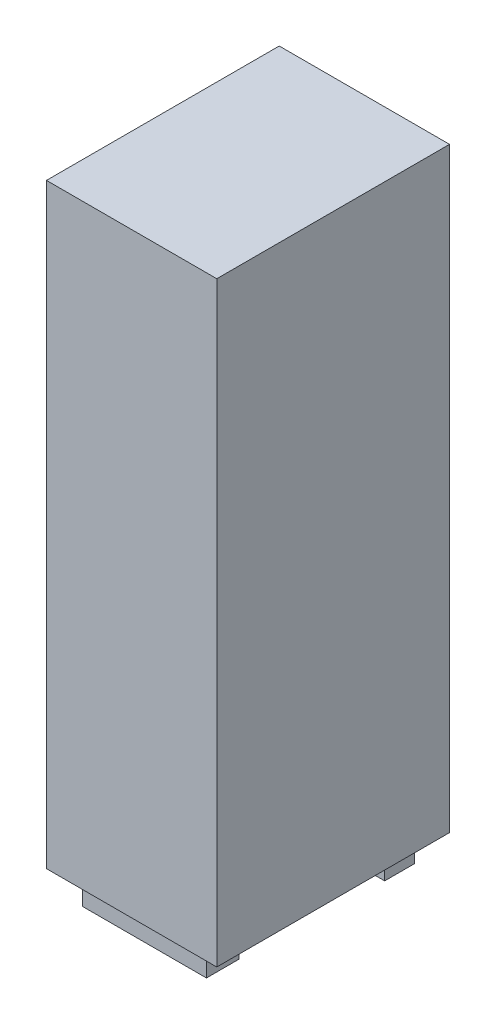
ISO-10303-21;
HEADER;
FILE_DESCRIPTION(('STEP AP214'),'2;1');
FILE_NAME('part.step','',(''),(''),'','','');
FILE_SCHEMA(('AUTOMOTIVE_DESIGN { 1 0 10303 214 1 1 1 1 }'));
ENDSEC;
DATA;
#1=APPLICATION_CONTEXT('core data for automotive mechanical design processes');
#2=APPLICATION_PROTOCOL_DEFINITION('international standard','automotive_design',2000,#1);
#3=PRODUCT_CONTEXT('',#1,'mechanical');
#4=PRODUCT('Part','Part','',(#3));
#5=PRODUCT_RELATED_PRODUCT_CATEGORY('part','',(#4));
#6=PRODUCT_DEFINITION_FORMATION('','',#4);
#7=PRODUCT_DEFINITION_CONTEXT('part definition',#1,'design');
#8=PRODUCT_DEFINITION('design','',#6,#7);
#9=PRODUCT_DEFINITION_SHAPE('','',#8);
#10=(LENGTH_UNIT() NAMED_UNIT(*) SI_UNIT(.MILLI.,.METRE.));
#11=(NAMED_UNIT(*) PLANE_ANGLE_UNIT() SI_UNIT($,.RADIAN.));
#12=(NAMED_UNIT(*) SI_UNIT($,.STERADIAN.) SOLID_ANGLE_UNIT());
#13=UNCERTAINTY_MEASURE_WITH_UNIT(LENGTH_MEASURE(1.E-05),#10,'distance_accuracy_value','');
#14=(GEOMETRIC_REPRESENTATION_CONTEXT(3) GLOBAL_UNCERTAINTY_ASSIGNED_CONTEXT((#13)) GLOBAL_UNIT_ASSIGNED_CONTEXT((#10,
#11,#12)) REPRESENTATION_CONTEXT('',''));
#15=CARTESIAN_POINT('',(0.,0.,0.));
#16=DIRECTION('',(0.,0.,1.));
#17=DIRECTION('',(1.,0.,0.));
#18=AXIS2_PLACEMENT_3D('',#15,#16,#17);
#19=CARTESIAN_POINT('',(0.,0.,0.));
#20=DIRECTION('',(0.,1.,0.));
#21=DIRECTION('',(0.,0.,1.));
#22=AXIS2_PLACEMENT_3D('',#19,#20,#21);
#23=PLANE('',#22);
#24=DIRECTION('',(0.,0.,-1.));
#25=VECTOR('',#24,1.);
#26=CARTESIAN_POINT('',(-11.0358135455843,0.,18.0848672239159));
#27=LINE('',#26,#25);
#28=CARTESIAN_POINT('',(-11.0358135455843,0.,18.0848672239159));
#29=VERTEX_POINT('',#28);
#30=CARTESIAN_POINT('',(-11.0358135455843,0.,12.3839932108392));
#31=VERTEX_POINT('',#30);
#32=EDGE_CURVE('E143',#29,#31,#27,.T.);
#33=ORIENTED_EDGE('',*,*,#32,.F.);
#34=DIRECTION('',(-1.,0.,0.));
#35=VECTOR('',#34,1.);
#36=CARTESIAN_POINT('',(-11.0358135455843,0.,18.0848672239159));
#37=LINE('',#36,#35);
#38=CARTESIAN_POINT('',(10.7661776125333,0.,18.0848672239159));
#39=VERTEX_POINT('',#38);
#40=EDGE_CURVE('E156',#39,#29,#37,.T.);
#41=ORIENTED_EDGE('',*,*,#40,.F.);
#42=DIRECTION('',(0.,0.,1.));
#43=VECTOR('',#42,1.);
#44=CARTESIAN_POINT('',(10.7661776125333,0.,18.0848672239159));
#45=LINE('',#44,#43);
#46=CARTESIAN_POINT('',(10.7661776125333,0.,12.3839932108392));
#47=VERTEX_POINT('',#46);
#48=EDGE_CURVE('E165',#47,#39,#45,.T.);
#49=ORIENTED_EDGE('',*,*,#48,.F.);
#50=DIRECTION('',(1.,0.,0.));
#51=VECTOR('',#50,1.);
#52=CARTESIAN_POINT('',(-11.0358135455843,0.,12.3839932108392));
#53=LINE('',#52,#51);
#54=EDGE_CURVE('E146',#31,#47,#53,.T.);
#55=ORIENTED_EDGE('',*,*,#54,.F.);
#56=EDGE_LOOP('',(#33,#41,#49,#55));
#57=FACE_BOUND('',#56,.T.);
#58=DIRECTION('',(0.,0.,-1.));
#59=VECTOR('',#58,1.);
#60=CARTESIAN_POINT('',(15.,0.,-20.5));
#61=LINE('',#60,#59);
#62=CARTESIAN_POINT('',(15.,0.,20.5));
#63=VERTEX_POINT('',#62);
#64=CARTESIAN_POINT('',(15.,0.,-20.5));
#65=VERTEX_POINT('',#64);
#66=EDGE_CURVE('E181',#63,#65,#61,.T.);
#67=ORIENTED_EDGE('',*,*,#66,.F.);
#68=DIRECTION('',(1.,0.,0.));
#69=VECTOR('',#68,1.);
#70=CARTESIAN_POINT('',(-15.,0.,20.5));
#71=LINE('',#70,#69);
#72=CARTESIAN_POINT('',(-15.,0.,20.5));
#73=VERTEX_POINT('',#72);
#74=EDGE_CURVE('E186',#73,#63,#71,.T.);
#75=ORIENTED_EDGE('',*,*,#74,.F.);
#76=DIRECTION('',(0.,0.,1.));
#77=VECTOR('',#76,1.);
#78=CARTESIAN_POINT('',(-15.,0.,-20.5));
#79=LINE('',#78,#77);
#80=CARTESIAN_POINT('',(-15.,0.,-20.5));
#81=VERTEX_POINT('',#80);
#82=EDGE_CURVE('E197',#81,#73,#79,.T.);
#83=ORIENTED_EDGE('',*,*,#82,.F.);
#84=DIRECTION('',(-1.,0.,0.));
#85=VECTOR('',#84,1.);
#86=CARTESIAN_POINT('',(-15.,0.,-20.5));
#87=LINE('',#86,#85);
#88=EDGE_CURVE('E195',#65,#81,#87,.T.);
#89=ORIENTED_EDGE('',*,*,#88,.F.);
#90=EDGE_LOOP('',(#67,#75,#83,#89));
#91=FACE_BOUND('',#90,.T.);
#92=DIRECTION('',(0.,0.,-1.));
#93=VECTOR('',#92,1.);
#94=CARTESIAN_POINT('',(-10.7276581935261,0.,-12.4225126298458));
#95=LINE('',#94,#93);
#96=CARTESIAN_POINT('',(-10.7276581935261,0.,-12.4225126298458));
#97=VERTEX_POINT('',#96);
#98=CARTESIAN_POINT('',(-10.7276581935261,0.,-17.6996730338424));
#99=VERTEX_POINT('',#98);
#100=EDGE_CURVE('E142',#97,#99,#95,.T.);
#101=ORIENTED_EDGE('',*,*,#100,.F.);
#102=DIRECTION('',(-1.,0.,0.));
#103=VECTOR('',#102,1.);
#104=CARTESIAN_POINT('',(-10.7276581935261,0.,-12.4225126298458));
#105=LINE('',#104,#103);
#106=CARTESIAN_POINT('',(11.6521242497006,0.,-12.4225126298458));
#107=VERTEX_POINT('',#106);
#108=EDGE_CURVE('E139',#107,#97,#105,.T.);
#109=ORIENTED_EDGE('',*,*,#108,.F.);
#110=DIRECTION('',(0.,0.,1.));
#111=VECTOR('',#110,1.);
#112=CARTESIAN_POINT('',(11.6521242497006,0.,-12.4225126298458));
#113=LINE('',#112,#111);
#114=CARTESIAN_POINT('',(11.6521242497006,0.,-17.6996730338424));
#115=VERTEX_POINT('',#114);
#116=EDGE_CURVE('E53',#115,#107,#113,.T.);
#117=ORIENTED_EDGE('',*,*,#116,.F.);
#118=DIRECTION('',(1.,0.,0.));
#119=VECTOR('',#118,1.);
#120=CARTESIAN_POINT('',(-10.7276581935261,0.,-17.6996730338424));
#121=LINE('',#120,#119);
#122=EDGE_CURVE('E48',#99,#115,#121,.T.);
#123=ORIENTED_EDGE('',*,*,#122,.F.);
#124=EDGE_LOOP('',(#101,#109,#117,#123));
#125=FACE_BOUND('',#124,.T.);
#126=ADVANCED_FACE('F33',(#57,#91,#125),#23,.F.);
#127=CARTESIAN_POINT('',(15.,105.,-20.5));
#128=DIRECTION('',(-1.,0.,0.));
#129=DIRECTION('',(0.,0.,1.));
#130=AXIS2_PLACEMENT_3D('',#127,#128,#129);
#131=PLANE('',#130);
#132=ORIENTED_EDGE('',*,*,#66,.T.);
#133=DIRECTION('',(0.,-1.,0.));
#134=VECTOR('',#133,1.);
#135=CARTESIAN_POINT('',(15.,105.,-20.5));
#136=LINE('',#135,#134);
#137=CARTESIAN_POINT('',(15.,105.,-20.5));
#138=VERTEX_POINT('',#137);
#139=EDGE_CURVE('E11',#138,#65,#136,.T.);
#140=ORIENTED_EDGE('',*,*,#139,.F.);
#141=DIRECTION('',(0.,0.,-1.));
#142=VECTOR('',#141,1.);
#143=CARTESIAN_POINT('',(15.,105.,-20.5));
#144=LINE('',#143,#142);
#145=CARTESIAN_POINT('',(15.,105.,20.5));
#146=VERTEX_POINT('',#145);
#147=EDGE_CURVE('E182',#146,#138,#144,.T.);
#148=ORIENTED_EDGE('',*,*,#147,.F.);
#149=DIRECTION('',(0.,-1.,0.));
#150=VECTOR('',#149,1.);
#151=CARTESIAN_POINT('',(15.,105.,20.5));
#152=LINE('',#151,#150);
#153=EDGE_CURVE('E192',#146,#63,#152,.T.);
#154=ORIENTED_EDGE('',*,*,#153,.T.);
#155=EDGE_LOOP('',(#132,#140,#148,#154));
#156=FACE_BOUND('',#155,.T.);
#157=ADVANCED_FACE('F35',(#156),#131,.F.);
#158=CARTESIAN_POINT('',(-15.,105.,-20.5));
#159=DIRECTION('',(0.,0.,1.));
#160=DIRECTION('',(1.,0.,0.));
#161=AXIS2_PLACEMENT_3D('',#158,#159,#160);
#162=PLANE('',#161);
#163=ORIENTED_EDGE('',*,*,#88,.T.);
#164=DIRECTION('',(0.,-1.,0.));
#165=VECTOR('',#164,1.);
#166=CARTESIAN_POINT('',(-15.,105.,-20.5));
#167=LINE('',#166,#165);
#168=CARTESIAN_POINT('',(-15.,105.,-20.5));
#169=VERTEX_POINT('',#168);
#170=EDGE_CURVE('E41',#169,#81,#167,.T.);
#171=ORIENTED_EDGE('',*,*,#170,.F.);
#172=DIRECTION('',(-1.,0.,0.));
#173=VECTOR('',#172,1.);
#174=CARTESIAN_POINT('',(-15.,105.,-20.5));
#175=LINE('',#174,#173);
#176=EDGE_CURVE('E185',#138,#169,#175,.T.);
#177=ORIENTED_EDGE('',*,*,#176,.F.);
#178=ORIENTED_EDGE('',*,*,#139,.T.);
#179=EDGE_LOOP('',(#163,#171,#177,#178));
#180=FACE_BOUND('',#179,.T.);
#181=ADVANCED_FACE('F224',(#180),#162,.F.);
#182=CARTESIAN_POINT('',(-15.,105.,-20.5));
#183=DIRECTION('',(1.,0.,0.));
#184=DIRECTION('',(0.,0.,-1.));
#185=AXIS2_PLACEMENT_3D('',#182,#183,#184);
#186=PLANE('',#185);
#187=ORIENTED_EDGE('',*,*,#82,.T.);
#188=DIRECTION('',(0.,-1.,0.));
#189=VECTOR('',#188,1.);
#190=CARTESIAN_POINT('',(-15.,105.,20.5));
#191=LINE('',#190,#189);
#192=CARTESIAN_POINT('',(-15.,105.,20.5));
#193=VERTEX_POINT('',#192);
#194=EDGE_CURVE('E202',#193,#73,#191,.T.);
#195=ORIENTED_EDGE('',*,*,#194,.F.);
#196=DIRECTION('',(0.,0.,1.));
#197=VECTOR('',#196,1.);
#198=CARTESIAN_POINT('',(-15.,105.,-20.5));
#199=LINE('',#198,#197);
#200=EDGE_CURVE('E188',#169,#193,#199,.T.);
#201=ORIENTED_EDGE('',*,*,#200,.F.);
#202=ORIENTED_EDGE('',*,*,#170,.T.);
#203=EDGE_LOOP('',(#187,#195,#201,#202));
#204=FACE_BOUND('',#203,.T.);
#205=ADVANCED_FACE('F209',(#204),#186,.F.);
#206=CARTESIAN_POINT('',(-15.,105.,20.5));
#207=DIRECTION('',(0.,0.,-1.));
#208=DIRECTION('',(-1.,0.,0.));
#209=AXIS2_PLACEMENT_3D('',#206,#207,#208);
#210=PLANE('',#209);
#211=ORIENTED_EDGE('',*,*,#74,.T.);
#212=ORIENTED_EDGE('',*,*,#153,.F.);
#213=DIRECTION('',(1.,0.,0.));
#214=VECTOR('',#213,1.);
#215=CARTESIAN_POINT('',(-15.,105.,20.5));
#216=LINE('',#215,#214);
#217=EDGE_CURVE('E190',#193,#146,#216,.T.);
#218=ORIENTED_EDGE('',*,*,#217,.F.);
#219=ORIENTED_EDGE('',*,*,#194,.T.);
#220=EDGE_LOOP('',(#211,#212,#218,#219));
#221=FACE_BOUND('',#220,.T.);
#222=ADVANCED_FACE('F217',(#221),#210,.F.);
#223=CARTESIAN_POINT('',(0.,105.,0.));
#224=DIRECTION('',(0.,1.,0.));
#225=DIRECTION('',(0.,0.,1.));
#226=AXIS2_PLACEMENT_3D('',#223,#224,#225);
#227=PLANE('',#226);
#228=ORIENTED_EDGE('',*,*,#147,.T.);
#229=ORIENTED_EDGE('',*,*,#176,.T.);
#230=ORIENTED_EDGE('',*,*,#200,.T.);
#231=ORIENTED_EDGE('',*,*,#217,.T.);
#232=EDGE_LOOP('',(#228,#229,#230,#231));
#233=FACE_BOUND('',#232,.T.);
#234=ADVANCED_FACE('F223',(#233),#227,.T.);
#235=CARTESIAN_POINT('',(-11.0358135455843,-5.,18.0848672239159));
#236=DIRECTION('',(1.,0.,0.));
#237=DIRECTION('',(0.,0.,-1.));
#238=AXIS2_PLACEMENT_3D('',#235,#236,#237);
#239=PLANE('',#238);
#240=ORIENTED_EDGE('',*,*,#32,.T.);
#241=DIRECTION('',(0.,1.,0.));
#242=VECTOR('',#241,1.);
#243=CARTESIAN_POINT('',(-11.0358135455843,-5.,12.3839932108392));
#244=LINE('',#243,#242);
#245=CARTESIAN_POINT('',(-11.0358135455843,-5.,12.3839932108392));
#246=VERTEX_POINT('',#245);
#247=EDGE_CURVE('E178',#246,#31,#244,.T.);
#248=ORIENTED_EDGE('',*,*,#247,.F.);
#249=DIRECTION('',(0.,0.,-1.));
#250=VECTOR('',#249,1.);
#251=CARTESIAN_POINT('',(-11.0358135455843,-5.,18.0848672239159));
#252=LINE('',#251,#250);
#253=CARTESIAN_POINT('',(-11.0358135455843,-5.,18.0848672239159));
#254=VERTEX_POINT('',#253);
#255=EDGE_CURVE('E152',#254,#246,#252,.T.);
#256=ORIENTED_EDGE('',*,*,#255,.F.);
#257=DIRECTION('',(0.,1.,0.));
#258=VECTOR('',#257,1.);
#259=CARTESIAN_POINT('',(-11.0358135455843,-5.,18.0848672239159));
#260=LINE('',#259,#258);
#261=EDGE_CURVE('E161',#254,#29,#260,.T.);
#262=ORIENTED_EDGE('',*,*,#261,.T.);
#263=EDGE_LOOP('',(#240,#248,#256,#262));
#264=FACE_BOUND('',#263,.T.);
#265=ADVANCED_FACE('F243',(#264),#239,.F.);
#266=CARTESIAN_POINT('',(-11.0358135455843,-5.,12.3839932108392));
#267=DIRECTION('',(0.,0.,1.));
#268=DIRECTION('',(1.,0.,0.));
#269=AXIS2_PLACEMENT_3D('',#266,#267,#268);
#270=PLANE('',#269);
#271=ORIENTED_EDGE('',*,*,#54,.T.);
#272=DIRECTION('',(0.,1.,0.));
#273=VECTOR('',#272,1.);
#274=CARTESIAN_POINT('',(10.7661776125333,-5.,12.3839932108392));
#275=LINE('',#274,#273);
#276=CARTESIAN_POINT('',(10.7661776125333,-5.,12.3839932108392));
#277=VERTEX_POINT('',#276);
#278=EDGE_CURVE('E175',#277,#47,#275,.T.);
#279=ORIENTED_EDGE('',*,*,#278,.F.);
#280=DIRECTION('',(1.,0.,0.));
#281=VECTOR('',#280,1.);
#282=CARTESIAN_POINT('',(-11.0358135455843,-5.,12.3839932108392));
#283=LINE('',#282,#281);
#284=EDGE_CURVE('E155',#246,#277,#283,.T.);
#285=ORIENTED_EDGE('',*,*,#284,.F.);
#286=ORIENTED_EDGE('',*,*,#247,.T.);
#287=EDGE_LOOP('',(#271,#279,#285,#286));
#288=FACE_BOUND('',#287,.T.);
#289=ADVANCED_FACE('F247',(#288),#270,.F.);
#290=CARTESIAN_POINT('',(10.7661776125333,-5.,18.0848672239159));
#291=DIRECTION('',(-1.,0.,0.));
#292=DIRECTION('',(0.,0.,1.));
#293=AXIS2_PLACEMENT_3D('',#290,#291,#292);
#294=PLANE('',#293);
#295=ORIENTED_EDGE('',*,*,#48,.T.);
#296=DIRECTION('',(0.,1.,0.));
#297=VECTOR('',#296,1.);
#298=CARTESIAN_POINT('',(10.7661776125333,-5.,18.0848672239159));
#299=LINE('',#298,#297);
#300=CARTESIAN_POINT('',(10.7661776125333,-5.,18.0848672239159));
#301=VERTEX_POINT('',#300);
#302=EDGE_CURVE('E172',#301,#39,#299,.T.);
#303=ORIENTED_EDGE('',*,*,#302,.F.);
#304=DIRECTION('',(0.,0.,1.));
#305=VECTOR('',#304,1.);
#306=CARTESIAN_POINT('',(10.7661776125333,-5.,18.0848672239159));
#307=LINE('',#306,#305);
#308=EDGE_CURVE('E158',#277,#301,#307,.T.);
#309=ORIENTED_EDGE('',*,*,#308,.F.);
#310=ORIENTED_EDGE('',*,*,#278,.T.);
#311=EDGE_LOOP('',(#295,#303,#309,#310));
#312=FACE_BOUND('',#311,.T.);
#313=ADVANCED_FACE('F252',(#312),#294,.F.);
#314=CARTESIAN_POINT('',(-11.0358135455843,-5.,18.0848672239159));
#315=DIRECTION('',(0.,0.,-1.));
#316=DIRECTION('',(-1.,0.,0.));
#317=AXIS2_PLACEMENT_3D('',#314,#315,#316);
#318=PLANE('',#317);
#319=ORIENTED_EDGE('',*,*,#40,.T.);
#320=ORIENTED_EDGE('',*,*,#261,.F.);
#321=DIRECTION('',(-1.,0.,0.));
#322=VECTOR('',#321,1.);
#323=CARTESIAN_POINT('',(-11.0358135455843,-5.,18.0848672239159));
#324=LINE('',#323,#322);
#325=EDGE_CURVE('E160',#301,#254,#324,.T.);
#326=ORIENTED_EDGE('',*,*,#325,.F.);
#327=ORIENTED_EDGE('',*,*,#302,.T.);
#328=EDGE_LOOP('',(#319,#320,#326,#327));
#329=FACE_BOUND('',#328,.T.);
#330=ADVANCED_FACE('F258',(#329),#318,.F.);
#331=CARTESIAN_POINT('',(0.,-5.,0.));
#332=DIRECTION('',(0.,-1.,0.));
#333=DIRECTION('',(0.,0.,-1.));
#334=AXIS2_PLACEMENT_3D('',#331,#332,#333);
#335=PLANE('',#334);
#336=ORIENTED_EDGE('',*,*,#255,.T.);
#337=ORIENTED_EDGE('',*,*,#284,.T.);
#338=ORIENTED_EDGE('',*,*,#308,.T.);
#339=ORIENTED_EDGE('',*,*,#325,.T.);
#340=EDGE_LOOP('',(#336,#337,#338,#339));
#341=FACE_BOUND('',#340,.T.);
#342=ADVANCED_FACE('F262',(#341),#335,.T.);
#343=CARTESIAN_POINT('',(-10.7276581935261,-5.,-12.4225126298458));
#344=DIRECTION('',(1.,0.,0.));
#345=DIRECTION('',(0.,0.,-1.));
#346=AXIS2_PLACEMENT_3D('',#343,#344,#345);
#347=PLANE('',#346);
#348=ORIENTED_EDGE('',*,*,#100,.T.);
#349=DIRECTION('',(0.,1.,0.));
#350=VECTOR('',#349,1.);
#351=CARTESIAN_POINT('',(-10.7276581935261,-5.,-17.6996730338424));
#352=LINE('',#351,#350);
#353=CARTESIAN_POINT('',(-10.7276581935261,-5.,-17.6996730338424));
#354=VERTEX_POINT('',#353);
#355=EDGE_CURVE('E123',#354,#99,#352,.T.);
#356=ORIENTED_EDGE('',*,*,#355,.F.);
#357=DIRECTION('',(0.,0.,-1.));
#358=VECTOR('',#357,1.);
#359=CARTESIAN_POINT('',(-10.7276581935261,-5.,-12.4225126298458));
#360=LINE('',#359,#358);
#361=CARTESIAN_POINT('',(-10.7276581935261,-5.,-12.4225126298458));
#362=VERTEX_POINT('',#361);
#363=EDGE_CURVE('E130',#362,#354,#360,.T.);
#364=ORIENTED_EDGE('',*,*,#363,.F.);
#365=DIRECTION('',(0.,1.,0.));
#366=VECTOR('',#365,1.);
#367=CARTESIAN_POINT('',(-10.7276581935261,-5.,-12.4225126298458));
#368=LINE('',#367,#366);
#369=EDGE_CURVE('E368',#362,#97,#368,.T.);
#370=ORIENTED_EDGE('',*,*,#369,.T.);
#371=EDGE_LOOP('',(#348,#356,#364,#370));
#372=FACE_BOUND('',#371,.T.);
#373=ADVANCED_FACE('F141',(#372),#347,.F.);
#374=CARTESIAN_POINT('',(-10.7276581935261,-5.,-17.6996730338424));
#375=DIRECTION('',(0.,0.,1.));
#376=DIRECTION('',(1.,0.,0.));
#377=AXIS2_PLACEMENT_3D('',#374,#375,#376);
#378=PLANE('',#377);
#379=ORIENTED_EDGE('',*,*,#122,.T.);
#380=DIRECTION('',(0.,1.,0.));
#381=VECTOR('',#380,1.);
#382=CARTESIAN_POINT('',(11.6521242497006,-5.,-17.6996730338424));
#383=LINE('',#382,#381);
#384=CARTESIAN_POINT('',(11.6521242497006,-5.,-17.6996730338424));
#385=VERTEX_POINT('',#384);
#386=EDGE_CURVE('E126',#385,#115,#383,.T.);
#387=ORIENTED_EDGE('',*,*,#386,.F.);
#388=DIRECTION('',(1.,0.,0.));
#389=VECTOR('',#388,1.);
#390=CARTESIAN_POINT('',(-10.7276581935261,-5.,-17.6996730338424));
#391=LINE('',#390,#389);
#392=EDGE_CURVE('E119',#354,#385,#391,.T.);
#393=ORIENTED_EDGE('',*,*,#392,.F.);
#394=ORIENTED_EDGE('',*,*,#355,.T.);
#395=EDGE_LOOP('',(#379,#387,#393,#394));
#396=FACE_BOUND('',#395,.T.);
#397=ADVANCED_FACE('F121',(#396),#378,.F.);
#398=CARTESIAN_POINT('',(11.6521242497006,-5.,-12.4225126298458));
#399=DIRECTION('',(-1.,0.,0.));
#400=DIRECTION('',(0.,0.,1.));
#401=AXIS2_PLACEMENT_3D('',#398,#399,#400);
#402=PLANE('',#401);
#403=ORIENTED_EDGE('',*,*,#116,.T.);
#404=DIRECTION('',(0.,1.,0.));
#405=VECTOR('',#404,1.);
#406=CARTESIAN_POINT('',(11.6521242497006,-5.,-12.4225126298458));
#407=LINE('',#406,#405);
#408=CARTESIAN_POINT('',(11.6521242497006,-5.,-12.4225126298458));
#409=VERTEX_POINT('',#408);
#410=EDGE_CURVE('E148',#409,#107,#407,.T.);
#411=ORIENTED_EDGE('',*,*,#410,.F.);
#412=DIRECTION('',(0.,0.,1.));
#413=VECTOR('',#412,1.);
#414=CARTESIAN_POINT('',(11.6521242497006,-5.,-12.4225126298458));
#415=LINE('',#414,#413);
#416=EDGE_CURVE('E129',#385,#409,#415,.T.);
#417=ORIENTED_EDGE('',*,*,#416,.F.);
#418=ORIENTED_EDGE('',*,*,#386,.T.);
#419=EDGE_LOOP('',(#403,#411,#417,#418));
#420=FACE_BOUND('',#419,.T.);
#421=ADVANCED_FACE('F271',(#420),#402,.F.);
#422=CARTESIAN_POINT('',(-10.7276581935261,-5.,-12.4225126298458));
#423=DIRECTION('',(0.,0.,-1.));
#424=DIRECTION('',(-1.,0.,0.));
#425=AXIS2_PLACEMENT_3D('',#422,#423,#424);
#426=PLANE('',#425);
#427=ORIENTED_EDGE('',*,*,#108,.T.);
#428=ORIENTED_EDGE('',*,*,#369,.F.);
#429=DIRECTION('',(-1.,0.,0.));
#430=VECTOR('',#429,1.);
#431=CARTESIAN_POINT('',(-10.7276581935261,-5.,-12.4225126298458));
#432=LINE('',#431,#430);
#433=EDGE_CURVE('E135',#409,#362,#432,.T.);
#434=ORIENTED_EDGE('',*,*,#433,.F.);
#435=ORIENTED_EDGE('',*,*,#410,.T.);
#436=EDGE_LOOP('',(#427,#428,#434,#435));
#437=FACE_BOUND('',#436,.T.);
#438=ADVANCED_FACE('F274',(#437),#426,.F.);
#439=CARTESIAN_POINT('',(0.,-5.,0.));
#440=DIRECTION('',(0.,-1.,0.));
#441=DIRECTION('',(0.,0.,-1.));
#442=AXIS2_PLACEMENT_3D('',#439,#440,#441);
#443=PLANE('',#442);
#444=ORIENTED_EDGE('',*,*,#363,.T.);
#445=ORIENTED_EDGE('',*,*,#392,.T.);
#446=ORIENTED_EDGE('',*,*,#416,.T.);
#447=ORIENTED_EDGE('',*,*,#433,.T.);
#448=EDGE_LOOP('',(#444,#445,#446,#447));
#449=FACE_BOUND('',#448,.T.);
#450=ADVANCED_FACE('F133',(#449),#443,.T.);
#451=CLOSED_SHELL('',(#126,#157,#181,#205,#222,#234,#265,#289,#313,#330,#342,#373,#397,#421,
#438,#450));
#452=MANIFOLD_SOLID_BREP('B2',#451);
#453=ADVANCED_BREP_SHAPE_REPRESENTATION('',(#18,#452),#14);
#454=SHAPE_DEFINITION_REPRESENTATION(#9,#453);
ENDSEC;
END-ISO-10303-21;
